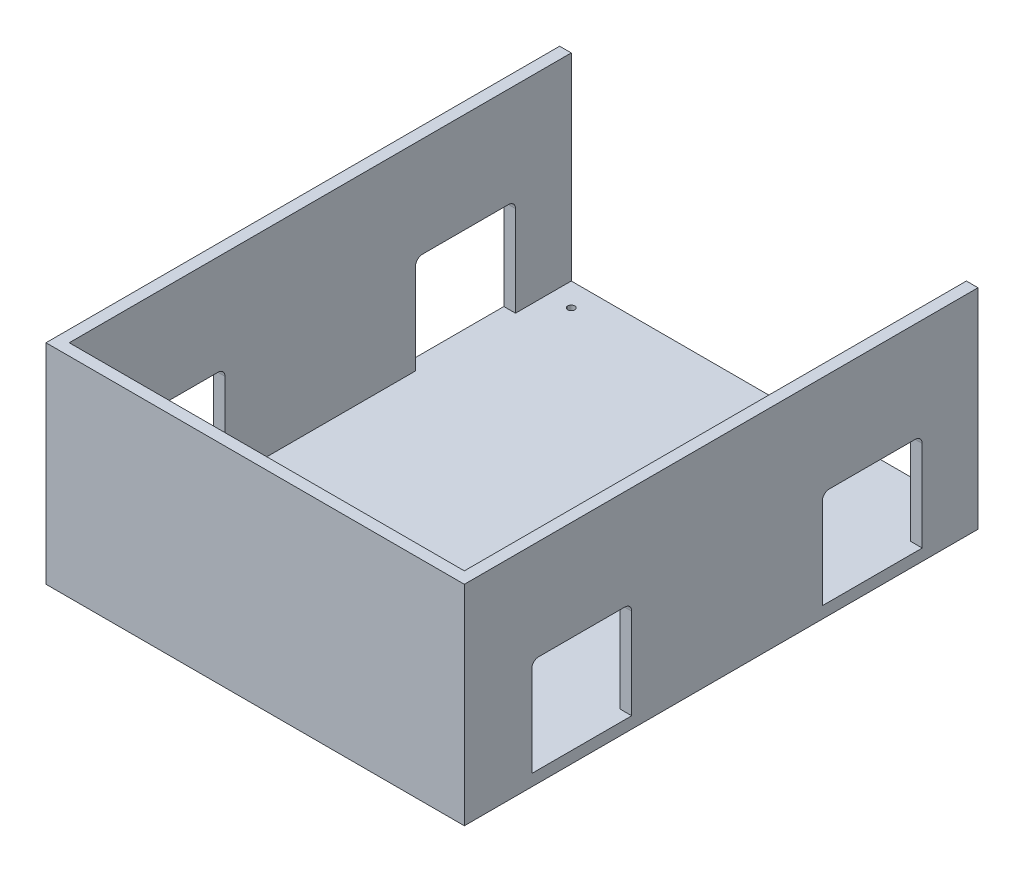
ISO-10303-21;
HEADER;
FILE_DESCRIPTION(('STEP AP214'),'2;1');
FILE_NAME('part.step','',(''),(''),'','','');
FILE_SCHEMA(('AUTOMOTIVE_DESIGN { 1 0 10303 214 1 1 1 1 }'));
ENDSEC;
DATA;
#1=APPLICATION_CONTEXT('core data for automotive mechanical design processes');
#2=APPLICATION_PROTOCOL_DEFINITION('international standard','automotive_design',2000,#1);
#3=PRODUCT_CONTEXT('',#1,'mechanical');
#4=PRODUCT('Part','Part','',(#3));
#5=PRODUCT_RELATED_PRODUCT_CATEGORY('part','',(#4));
#6=PRODUCT_DEFINITION_FORMATION('','',#4);
#7=PRODUCT_DEFINITION_CONTEXT('part definition',#1,'design');
#8=PRODUCT_DEFINITION('design','',#6,#7);
#9=PRODUCT_DEFINITION_SHAPE('','',#8);
#10=(LENGTH_UNIT() NAMED_UNIT(*) SI_UNIT(.MILLI.,.METRE.));
#11=(NAMED_UNIT(*) PLANE_ANGLE_UNIT() SI_UNIT($,.RADIAN.));
#12=(NAMED_UNIT(*) SI_UNIT($,.STERADIAN.) SOLID_ANGLE_UNIT());
#13=UNCERTAINTY_MEASURE_WITH_UNIT(LENGTH_MEASURE(1.E-05),#10,'distance_accuracy_value','');
#14=(GEOMETRIC_REPRESENTATION_CONTEXT(3) GLOBAL_UNCERTAINTY_ASSIGNED_CONTEXT((#13)) GLOBAL_UNIT_ASSIGNED_CONTEXT((#10,
#11,#12)) REPRESENTATION_CONTEXT('',''));
#15=CARTESIAN_POINT('',(0.,0.,0.));
#16=DIRECTION('',(0.,0.,1.));
#17=DIRECTION('',(1.,0.,0.));
#18=AXIS2_PLACEMENT_3D('',#15,#16,#17);
#19=CARTESIAN_POINT('',(0.,0.,0.));
#20=DIRECTION('',(0.,1.,0.));
#21=DIRECTION('',(0.,0.,1.));
#22=AXIS2_PLACEMENT_3D('',#19,#20,#21);
#23=PLANE('',#22);
#24=CARTESIAN_POINT('',(-75.,0.,-98.));
#25=DIRECTION('',(0.,1.,0.));
#26=DIRECTION('',(0.,0.,1.));
#27=AXIS2_PLACEMENT_3D('',#24,#25,#26);
#28=CIRCLE('',#27,1.5);
#29=CARTESIAN_POINT('',(-75.,0.,-96.5));
#30=VERTEX_POINT('',#29);
#31=EDGE_CURVE('E494',#30,#30,#28,.T.);
#32=ORIENTED_EDGE('',*,*,#31,.T.);
#33=EDGE_LOOP('',(#32));
#34=FACE_BOUND('',#33,.T.);
#35=CARTESIAN_POINT('',(75.,0.,98.));
#36=DIRECTION('',(0.,1.,0.));
#37=DIRECTION('',(0.,0.,1.));
#38=AXIS2_PLACEMENT_3D('',#35,#36,#37);
#39=CIRCLE('',#38,1.5);
#40=CARTESIAN_POINT('',(75.,0.,99.5));
#41=VERTEX_POINT('',#40);
#42=EDGE_CURVE('E473',#41,#41,#39,.T.);
#43=ORIENTED_EDGE('',*,*,#42,.T.);
#44=EDGE_LOOP('',(#43));
#45=FACE_BOUND('',#44,.T.);
#46=CARTESIAN_POINT('',(-75.,0.,98.));
#47=DIRECTION('',(0.,1.,0.));
#48=DIRECTION('',(0.,0.,1.));
#49=AXIS2_PLACEMENT_3D('',#46,#47,#48);
#50=CIRCLE('',#49,1.5);
#51=CARTESIAN_POINT('',(-75.,0.,99.5));
#52=VERTEX_POINT('',#51);
#53=EDGE_CURVE('E478',#52,#52,#50,.T.);
#54=ORIENTED_EDGE('',*,*,#53,.T.);
#55=EDGE_LOOP('',(#54));
#56=FACE_BOUND('',#55,.T.);
#57=CARTESIAN_POINT('',(75.,0.,-98.));
#58=DIRECTION('',(0.,1.,0.));
#59=DIRECTION('',(0.,0.,1.));
#60=AXIS2_PLACEMENT_3D('',#57,#58,#59);
#61=CIRCLE('',#60,1.5);
#62=CARTESIAN_POINT('',(75.,0.,-96.5));
#63=VERTEX_POINT('',#62);
#64=EDGE_CURVE('E488',#63,#63,#61,.T.);
#65=ORIENTED_EDGE('',*,*,#64,.T.);
#66=EDGE_LOOP('',(#65));
#67=FACE_BOUND('',#66,.T.);
#68=DIRECTION('',(-1.,0.,0.));
#69=VECTOR('',#68,1.);
#70=CARTESIAN_POINT('',(90.,0.,-108.));
#71=LINE('',#70,#69);
#72=CARTESIAN_POINT('',(90.,0.,-108.));
#73=VERTEX_POINT('',#72);
#74=CARTESIAN_POINT('',(-90.,0.,-108.));
#75=VERTEX_POINT('',#74);
#76=EDGE_CURVE('E283',#73,#75,#71,.T.);
#77=ORIENTED_EDGE('',*,*,#76,.F.);
#78=DIRECTION('',(0.,0.,-1.));
#79=VECTOR('',#78,1.);
#80=CARTESIAN_POINT('',(90.,0.,108.));
#81=LINE('',#80,#79);
#82=CARTESIAN_POINT('',(90.,0.,113.));
#83=VERTEX_POINT('',#82);
#84=EDGE_CURVE('E264',#83,#73,#81,.T.);
#85=ORIENTED_EDGE('',*,*,#84,.F.);
#86=DIRECTION('',(1.,0.,0.));
#87=VECTOR('',#86,1.);
#88=CARTESIAN_POINT('',(-90.,0.,113.));
#89=LINE('',#88,#87);
#90=CARTESIAN_POINT('',(-90.,0.,113.));
#91=VERTEX_POINT('',#90);
#92=EDGE_CURVE('E262',#91,#83,#89,.T.);
#93=ORIENTED_EDGE('',*,*,#92,.F.);
#94=DIRECTION('',(0.,0.,1.));
#95=VECTOR('',#94,1.);
#96=CARTESIAN_POINT('',(-90.,0.,108.));
#97=LINE('',#96,#95);
#98=EDGE_CURVE('E249',#75,#91,#97,.T.);
#99=ORIENTED_EDGE('',*,*,#98,.F.);
#100=EDGE_LOOP('',(#77,#85,#93,#99));
#101=FACE_BOUND('',#100,.T.);
#102=ADVANCED_FACE('F39',(#34,#45,#56,#67,#101),#23,.F.);
#103=CARTESIAN_POINT('',(85.,90.,-111.));
#104=DIRECTION('',(0.,-1.,0.));
#105=DIRECTION('',(0.,0.,-1.));
#106=AXIS2_PLACEMENT_3D('',#103,#104,#105);
#107=PLANE('',#106);
#108=DIRECTION('',(1.,0.,0.));
#109=VECTOR('',#108,1.);
#110=CARTESIAN_POINT('',(90.,90.,-108.));
#111=LINE('',#110,#109);
#112=CARTESIAN_POINT('',(85.,90.,-108.));
#113=VERTEX_POINT('',#112);
#114=CARTESIAN_POINT('',(90.,90.,-108.));
#115=VERTEX_POINT('',#114);
#116=EDGE_CURVE('E290',#113,#115,#111,.T.);
#117=ORIENTED_EDGE('',*,*,#116,.F.);
#118=DIRECTION('',(0.,0.,1.));
#119=VECTOR('',#118,1.);
#120=CARTESIAN_POINT('',(85.,90.,108.));
#121=LINE('',#120,#119);
#122=CARTESIAN_POINT('',(85.,90.,108.));
#123=VERTEX_POINT('',#122);
#124=EDGE_CURVE('E464',#113,#123,#121,.T.);
#125=ORIENTED_EDGE('',*,*,#124,.T.);
#126=DIRECTION('',(-1.,0.,0.));
#127=VECTOR('',#126,1.);
#128=CARTESIAN_POINT('',(-90.,90.,108.));
#129=LINE('',#128,#127);
#130=CARTESIAN_POINT('',(-85.,90.,108.));
#131=VERTEX_POINT('',#130);
#132=EDGE_CURVE('E273',#123,#131,#129,.T.);
#133=ORIENTED_EDGE('',*,*,#132,.T.);
#134=DIRECTION('',(0.,0.,-1.));
#135=VECTOR('',#134,1.);
#136=CARTESIAN_POINT('',(-85.,90.,-111.));
#137=LINE('',#136,#135);
#138=CARTESIAN_POINT('',(-84.9999999999999,90.,-108.));
#139=VERTEX_POINT('',#138);
#140=EDGE_CURVE('E375',#131,#139,#137,.T.);
#141=ORIENTED_EDGE('',*,*,#140,.T.);
#142=CARTESIAN_POINT('',(-90.,90.,-108.));
#143=VERTEX_POINT('',#142);
#144=EDGE_CURVE('E286',#143,#139,#111,.T.);
#145=ORIENTED_EDGE('',*,*,#144,.F.);
#146=DIRECTION('',(0.,0.,-1.));
#147=VECTOR('',#146,1.);
#148=CARTESIAN_POINT('',(-90.,90.,-111.));
#149=LINE('',#148,#147);
#150=CARTESIAN_POINT('',(-90.,90.,113.));
#151=VERTEX_POINT('',#150);
#152=EDGE_CURVE('E258',#151,#143,#149,.T.);
#153=ORIENTED_EDGE('',*,*,#152,.F.);
#154=DIRECTION('',(-1.,0.,0.));
#155=VECTOR('',#154,1.);
#156=CARTESIAN_POINT('',(-90.,90.,113.));
#157=LINE('',#156,#155);
#158=CARTESIAN_POINT('',(90.,90.,113.));
#159=VERTEX_POINT('',#158);
#160=EDGE_CURVE('E274',#159,#151,#157,.T.);
#161=ORIENTED_EDGE('',*,*,#160,.F.);
#162=DIRECTION('',(0.,0.,1.));
#163=VECTOR('',#162,1.);
#164=CARTESIAN_POINT('',(90.,90.,108.));
#165=LINE('',#164,#163);
#166=EDGE_CURVE('E461',#115,#159,#165,.T.);
#167=ORIENTED_EDGE('',*,*,#166,.F.);
#168=EDGE_LOOP('',(#117,#125,#133,#141,#145,#153,#161,#167));
#169=FACE_BOUND('',#168,.T.);
#170=ADVANCED_FACE('F576',(#169),#107,.F.);
#171=CARTESIAN_POINT('',(90.,0.,0.));
#172=DIRECTION('',(-1.,0.,0.));
#173=DIRECTION('',(0.,0.,1.));
#174=AXIS2_PLACEMENT_3D('',#171,#172,#173);
#175=PLANE('',#174);
#176=DIRECTION('',(0.,1.,0.));
#177=VECTOR('',#176,1.);
#178=CARTESIAN_POINT('',(90.,5.,-84.));
#179=LINE('',#178,#177);
#180=CARTESIAN_POINT('',(90.,5.,-84.));
#181=VERTEX_POINT('',#180);
#182=CARTESIAN_POINT('',(90.,44.,-84.));
#183=VERTEX_POINT('',#182);
#184=EDGE_CURVE('E377',#181,#183,#179,.T.);
#185=ORIENTED_EDGE('',*,*,#184,.F.);
#186=DIRECTION('',(0.,0.,-1.));
#187=VECTOR('',#186,1.);
#188=CARTESIAN_POINT('',(90.,5.,-84.));
#189=LINE('',#188,#187);
#190=CARTESIAN_POINT('',(90.,4.99999999999999,-41.));
#191=VERTEX_POINT('',#190);
#192=EDGE_CURVE('E388',#191,#181,#189,.T.);
#193=ORIENTED_EDGE('',*,*,#192,.F.);
#194=DIRECTION('',(0.,-1.,0.));
#195=VECTOR('',#194,1.);
#196=CARTESIAN_POINT('',(90.,4.99999999999999,-41.));
#197=LINE('',#196,#195);
#198=CARTESIAN_POINT('',(90.,44.,-41.));
#199=VERTEX_POINT('',#198);
#200=EDGE_CURVE('E389',#199,#191,#197,.T.);
#201=ORIENTED_EDGE('',*,*,#200,.F.);
#202=CARTESIAN_POINT('',(90.,44.,-44.));
#203=DIRECTION('',(1.,0.,0.));
#204=DIRECTION('',(0.,0.,-1.));
#205=AXIS2_PLACEMENT_3D('',#202,#203,#204);
#206=CIRCLE('',#205,3.00000000000001);
#207=CARTESIAN_POINT('',(90.,47.,-44.));
#208=VERTEX_POINT('',#207);
#209=EDGE_CURVE('E383',#208,#199,#206,.T.);
#210=ORIENTED_EDGE('',*,*,#209,.F.);
#211=DIRECTION('',(0.,0.,1.));
#212=VECTOR('',#211,1.);
#213=CARTESIAN_POINT('',(90.,47.,-81.));
#214=LINE('',#213,#212);
#215=CARTESIAN_POINT('',(90.,47.,-81.));
#216=VERTEX_POINT('',#215);
#217=EDGE_CURVE('E384',#216,#208,#214,.T.);
#218=ORIENTED_EDGE('',*,*,#217,.F.);
#219=CARTESIAN_POINT('',(90.,44.,-81.));
#220=DIRECTION('',(1.,0.,0.));
#221=DIRECTION('',(0.,0.,-1.));
#222=AXIS2_PLACEMENT_3D('',#219,#220,#221);
#223=CIRCLE('',#222,3.);
#224=EDGE_CURVE('E379',#183,#216,#223,.T.);
#225=ORIENTED_EDGE('',*,*,#224,.F.);
#226=EDGE_LOOP('',(#185,#193,#201,#210,#218,#225));
#227=FACE_BOUND('',#226,.T.);
#228=DIRECTION('',(0.,-1.,0.));
#229=VECTOR('',#228,1.);
#230=CARTESIAN_POINT('',(90.,5.,84.));
#231=LINE('',#230,#229);
#232=CARTESIAN_POINT('',(90.,44.,84.));
#233=VERTEX_POINT('',#232);
#234=CARTESIAN_POINT('',(90.,5.,84.));
#235=VERTEX_POINT('',#234);
#236=EDGE_CURVE('E417',#233,#235,#231,.T.);
#237=ORIENTED_EDGE('',*,*,#236,.F.);
#238=CARTESIAN_POINT('',(90.,44.,81.));
#239=DIRECTION('',(1.,0.,0.));
#240=DIRECTION('',(0.,0.,1.));
#241=AXIS2_PLACEMENT_3D('',#238,#239,#240);
#242=CIRCLE('',#241,3.);
#243=CARTESIAN_POINT('',(90.,47.,81.));
#244=VERTEX_POINT('',#243);
#245=EDGE_CURVE('E435',#244,#233,#242,.T.);
#246=ORIENTED_EDGE('',*,*,#245,.F.);
#247=DIRECTION('',(0.,0.,1.));
#248=VECTOR('',#247,1.);
#249=CARTESIAN_POINT('',(90.,47.,81.));
#250=LINE('',#249,#248);
#251=CARTESIAN_POINT('',(90.,47.,44.));
#252=VERTEX_POINT('',#251);
#253=EDGE_CURVE('E429',#252,#244,#250,.T.);
#254=ORIENTED_EDGE('',*,*,#253,.F.);
#255=CARTESIAN_POINT('',(90.,44.,44.));
#256=DIRECTION('',(1.,0.,0.));
#257=DIRECTION('',(0.,0.,1.));
#258=AXIS2_PLACEMENT_3D('',#255,#256,#257);
#259=CIRCLE('',#258,3.);
#260=CARTESIAN_POINT('',(90.,44.,41.));
#261=VERTEX_POINT('',#260);
#262=EDGE_CURVE('E430',#261,#252,#259,.T.);
#263=ORIENTED_EDGE('',*,*,#262,.F.);
#264=DIRECTION('',(0.,1.,0.));
#265=VECTOR('',#264,1.);
#266=CARTESIAN_POINT('',(90.,5.,41.));
#267=LINE('',#266,#265);
#268=CARTESIAN_POINT('',(90.,5.,41.));
#269=VERTEX_POINT('',#268);
#270=EDGE_CURVE('E424',#269,#261,#267,.T.);
#271=ORIENTED_EDGE('',*,*,#270,.F.);
#272=DIRECTION('',(0.,0.,-1.));
#273=VECTOR('',#272,1.);
#274=CARTESIAN_POINT('',(90.,5.,84.));
#275=LINE('',#274,#273);
#276=EDGE_CURVE('E422',#235,#269,#275,.T.);
#277=ORIENTED_EDGE('',*,*,#276,.F.);
#278=EDGE_LOOP('',(#237,#246,#254,#263,#271,#277));
#279=FACE_BOUND('',#278,.T.);
#280=DIRECTION('',(0.,-1.,0.));
#281=VECTOR('',#280,1.);
#282=CARTESIAN_POINT('',(90.,0.,-108.));
#283=LINE('',#282,#281);
#284=EDGE_CURVE('E281',#115,#73,#283,.T.);
#285=ORIENTED_EDGE('',*,*,#284,.F.);
#286=ORIENTED_EDGE('',*,*,#166,.T.);
#287=DIRECTION('',(0.,1.,0.));
#288=VECTOR('',#287,1.);
#289=CARTESIAN_POINT('',(90.,0.,113.));
#290=LINE('',#289,#288);
#291=EDGE_CURVE('E269',#83,#159,#290,.T.);
#292=ORIENTED_EDGE('',*,*,#291,.F.);
#293=ORIENTED_EDGE('',*,*,#84,.T.);
#294=EDGE_LOOP('',(#285,#286,#292,#293));
#295=FACE_BOUND('',#294,.T.);
#296=ADVANCED_FACE('F528',(#227,#279,#295),#175,.F.);
#297=CARTESIAN_POINT('',(-90.,0.,0.));
#298=DIRECTION('',(1.,0.,0.));
#299=DIRECTION('',(0.,0.,-1.));
#300=AXIS2_PLACEMENT_3D('',#297,#298,#299);
#301=PLANE('',#300);
#302=DIRECTION('',(0.,0.,1.));
#303=VECTOR('',#302,1.);
#304=CARTESIAN_POINT('',(-90.,5.,84.));
#305=LINE('',#304,#303);
#306=CARTESIAN_POINT('',(-90.,5.,41.));
#307=VERTEX_POINT('',#306);
#308=CARTESIAN_POINT('',(-90.,5.,84.));
#309=VERTEX_POINT('',#308);
#310=EDGE_CURVE('E293',#307,#309,#305,.T.);
#311=ORIENTED_EDGE('',*,*,#310,.F.);
#312=DIRECTION('',(0.,-1.,0.));
#313=VECTOR('',#312,1.);
#314=CARTESIAN_POINT('',(-90.,5.,41.));
#315=LINE('',#314,#313);
#316=CARTESIAN_POINT('',(-90.,44.,41.));
#317=VERTEX_POINT('',#316);
#318=EDGE_CURVE('E303',#317,#307,#315,.T.);
#319=ORIENTED_EDGE('',*,*,#318,.F.);
#320=CARTESIAN_POINT('',(-90.,44.,44.));
#321=DIRECTION('',(-1.,0.,0.));
#322=DIRECTION('',(0.,0.,-1.));
#323=AXIS2_PLACEMENT_3D('',#320,#321,#322);
#324=CIRCLE('',#323,3.);
#325=CARTESIAN_POINT('',(-90.,47.,44.));
#326=VERTEX_POINT('',#325);
#327=EDGE_CURVE('E297',#326,#317,#324,.T.);
#328=ORIENTED_EDGE('',*,*,#327,.F.);
#329=DIRECTION('',(0.,0.,-1.));
#330=VECTOR('',#329,1.);
#331=CARTESIAN_POINT('',(-90.,47.,44.));
#332=LINE('',#331,#330);
#333=CARTESIAN_POINT('',(-90.,47.,81.));
#334=VERTEX_POINT('',#333);
#335=EDGE_CURVE('E296',#334,#326,#332,.T.);
#336=ORIENTED_EDGE('',*,*,#335,.F.);
#337=CARTESIAN_POINT('',(-90.,44.,81.));
#338=DIRECTION('',(-1.,0.,0.));
#339=DIRECTION('',(0.,0.,-1.));
#340=AXIS2_PLACEMENT_3D('',#337,#338,#339);
#341=CIRCLE('',#340,3.);
#342=CARTESIAN_POINT('',(-90.,44.,84.));
#343=VERTEX_POINT('',#342);
#344=EDGE_CURVE('E298',#343,#334,#341,.T.);
#345=ORIENTED_EDGE('',*,*,#344,.F.);
#346=DIRECTION('',(0.,1.,0.));
#347=VECTOR('',#346,1.);
#348=CARTESIAN_POINT('',(-90.,44.,84.));
#349=LINE('',#348,#347);
#350=EDGE_CURVE('E291',#309,#343,#349,.T.);
#351=ORIENTED_EDGE('',*,*,#350,.F.);
#352=EDGE_LOOP('',(#311,#319,#328,#336,#345,#351));
#353=FACE_BOUND('',#352,.T.);
#354=DIRECTION('',(0.,0.,1.));
#355=VECTOR('',#354,1.);
#356=CARTESIAN_POINT('',(-90.,4.99999999999999,-41.));
#357=LINE('',#356,#355);
#358=CARTESIAN_POINT('',(-90.,5.,-84.));
#359=VERTEX_POINT('',#358);
#360=CARTESIAN_POINT('',(-90.,4.99999999999999,-41.));
#361=VERTEX_POINT('',#360);
#362=EDGE_CURVE('E333',#359,#361,#357,.T.);
#363=ORIENTED_EDGE('',*,*,#362,.F.);
#364=DIRECTION('',(0.,-1.,0.));
#365=VECTOR('',#364,1.);
#366=CARTESIAN_POINT('',(-90.,5.,-84.));
#367=LINE('',#366,#365);
#368=CARTESIAN_POINT('',(-90.,44.,-84.));
#369=VERTEX_POINT('',#368);
#370=EDGE_CURVE('E345',#369,#359,#367,.T.);
#371=ORIENTED_EDGE('',*,*,#370,.F.);
#372=CARTESIAN_POINT('',(-90.,44.,-81.));
#373=DIRECTION('',(-1.,0.,0.));
#374=DIRECTION('',(0.,0.,-1.));
#375=AXIS2_PLACEMENT_3D('',#372,#373,#374);
#376=CIRCLE('',#375,3.);
#377=CARTESIAN_POINT('',(-90.,47.,-81.));
#378=VERTEX_POINT('',#377);
#379=EDGE_CURVE('E338',#378,#369,#376,.T.);
#380=ORIENTED_EDGE('',*,*,#379,.F.);
#381=DIRECTION('',(0.,0.,-1.));
#382=VECTOR('',#381,1.);
#383=CARTESIAN_POINT('',(-90.,47.,-81.));
#384=LINE('',#383,#382);
#385=CARTESIAN_POINT('',(-90.,47.,-44.));
#386=VERTEX_POINT('',#385);
#387=EDGE_CURVE('E336',#386,#378,#384,.T.);
#388=ORIENTED_EDGE('',*,*,#387,.F.);
#389=CARTESIAN_POINT('',(-90.,44.,-44.));
#390=DIRECTION('',(-1.,0.,0.));
#391=DIRECTION('',(0.,0.,-1.));
#392=AXIS2_PLACEMENT_3D('',#389,#390,#391);
#393=CIRCLE('',#392,3.00000000000002);
#394=CARTESIAN_POINT('',(-90.,44.,-41.));
#395=VERTEX_POINT('',#394);
#396=EDGE_CURVE('E337',#395,#386,#393,.T.);
#397=ORIENTED_EDGE('',*,*,#396,.F.);
#398=DIRECTION('',(0.,1.,0.));
#399=VECTOR('',#398,1.);
#400=CARTESIAN_POINT('',(-90.,44.,-41.));
#401=LINE('',#400,#399);
#402=EDGE_CURVE('E331',#361,#395,#401,.T.);
#403=ORIENTED_EDGE('',*,*,#402,.F.);
#404=EDGE_LOOP('',(#363,#371,#380,#388,#397,#403));
#405=FACE_BOUND('',#404,.T.);
#406=DIRECTION('',(0.,1.,0.));
#407=VECTOR('',#406,1.);
#408=CARTESIAN_POINT('',(-90.,0.,-108.));
#409=LINE('',#408,#407);
#410=EDGE_CURVE('E257',#75,#143,#409,.T.);
#411=ORIENTED_EDGE('',*,*,#410,.F.);
#412=ORIENTED_EDGE('',*,*,#98,.T.);
#413=DIRECTION('',(0.,-1.,0.));
#414=VECTOR('',#413,1.);
#415=CARTESIAN_POINT('',(-90.,0.,113.));
#416=LINE('',#415,#414);
#417=EDGE_CURVE('E253',#151,#91,#416,.T.);
#418=ORIENTED_EDGE('',*,*,#417,.F.);
#419=ORIENTED_EDGE('',*,*,#152,.T.);
#420=EDGE_LOOP('',(#411,#412,#418,#419));
#421=FACE_BOUND('',#420,.T.);
#422=ADVANCED_FACE('F255',(#353,#405,#421),#301,.F.);
#423=CARTESIAN_POINT('',(0.,5.,0.));
#424=DIRECTION('',(0.,1.,0.));
#425=DIRECTION('',(0.,0.,1.));
#426=AXIS2_PLACEMENT_3D('',#423,#424,#425);
#427=PLANE('',#426);
#428=CARTESIAN_POINT('',(75.,5.,-98.));
#429=DIRECTION('',(0.,1.,0.));
#430=DIRECTION('',(0.,0.,1.));
#431=AXIS2_PLACEMENT_3D('',#428,#429,#430);
#432=CIRCLE('',#431,1.5);
#433=CARTESIAN_POINT('',(75.,5.,-96.5));
#434=VERTEX_POINT('',#433);
#435=EDGE_CURVE('E485',#434,#434,#432,.T.);
#436=ORIENTED_EDGE('',*,*,#435,.F.);
#437=EDGE_LOOP('',(#436));
#438=FACE_BOUND('',#437,.T.);
#439=CARTESIAN_POINT('',(-75.,5.,98.));
#440=DIRECTION('',(0.,1.,0.));
#441=DIRECTION('',(0.,0.,1.));
#442=AXIS2_PLACEMENT_3D('',#439,#440,#441);
#443=CIRCLE('',#442,1.5);
#444=CARTESIAN_POINT('',(-75.,5.,99.5));
#445=VERTEX_POINT('',#444);
#446=EDGE_CURVE('E490',#445,#445,#443,.T.);
#447=ORIENTED_EDGE('',*,*,#446,.F.);
#448=EDGE_LOOP('',(#447));
#449=FACE_BOUND('',#448,.T.);
#450=CARTESIAN_POINT('',(75.,5.,98.));
#451=DIRECTION('',(0.,1.,0.));
#452=DIRECTION('',(0.,0.,1.));
#453=AXIS2_PLACEMENT_3D('',#450,#451,#452);
#454=CIRCLE('',#453,1.5);
#455=CARTESIAN_POINT('',(75.,5.,99.5));
#456=VERTEX_POINT('',#455);
#457=EDGE_CURVE('E476',#456,#456,#454,.T.);
#458=ORIENTED_EDGE('',*,*,#457,.F.);
#459=EDGE_LOOP('',(#458));
#460=FACE_BOUND('',#459,.T.);
#461=CARTESIAN_POINT('',(-75.,5.,-98.));
#462=DIRECTION('',(0.,1.,0.));
#463=DIRECTION('',(0.,0.,1.));
#464=AXIS2_PLACEMENT_3D('',#461,#462,#463);
#465=CIRCLE('',#464,1.5);
#466=CARTESIAN_POINT('',(-75.,5.,-96.5));
#467=VERTEX_POINT('',#466);
#468=EDGE_CURVE('E482',#467,#467,#465,.T.);
#469=ORIENTED_EDGE('',*,*,#468,.F.);
#470=EDGE_LOOP('',(#469));
#471=FACE_BOUND('',#470,.T.);
#472=DIRECTION('',(0.,0.,-1.));
#473=VECTOR('',#472,1.);
#474=CARTESIAN_POINT('',(85.,5.,-108.));
#475=LINE('',#474,#473);
#476=CARTESIAN_POINT('',(85.,5.,108.));
#477=VERTEX_POINT('',#476);
#478=CARTESIAN_POINT('',(85.,5.,84.));
#479=VERTEX_POINT('',#478);
#480=EDGE_CURVE('E499',#477,#479,#475,.T.);
#481=ORIENTED_EDGE('',*,*,#480,.T.);
#482=DIRECTION('',(-1.,0.,0.));
#483=VECTOR('',#482,1.);
#484=CARTESIAN_POINT('',(90.,5.,84.));
#485=LINE('',#484,#483);
#486=EDGE_CURVE('E458',#235,#479,#485,.T.);
#487=ORIENTED_EDGE('',*,*,#486,.F.);
#488=ORIENTED_EDGE('',*,*,#276,.T.);
#489=DIRECTION('',(-1.,0.,0.));
#490=VECTOR('',#489,1.);
#491=CARTESIAN_POINT('',(90.,5.,41.));
#492=LINE('',#491,#490);
#493=CARTESIAN_POINT('',(85.,5.,41.));
#494=VERTEX_POINT('',#493);
#495=EDGE_CURVE('E456',#269,#494,#492,.T.);
#496=ORIENTED_EDGE('',*,*,#495,.T.);
#497=CARTESIAN_POINT('',(85.,4.99999999999999,-41.));
#498=VERTEX_POINT('',#497);
#499=EDGE_CURVE('E502',#494,#498,#475,.T.);
#500=ORIENTED_EDGE('',*,*,#499,.T.);
#501=DIRECTION('',(-1.,0.,0.));
#502=VECTOR('',#501,1.);
#503=CARTESIAN_POINT('',(90.,4.99999999999999,-41.));
#504=LINE('',#503,#502);
#505=EDGE_CURVE('E410',#191,#498,#504,.T.);
#506=ORIENTED_EDGE('',*,*,#505,.F.);
#507=ORIENTED_EDGE('',*,*,#192,.T.);
#508=DIRECTION('',(-1.,0.,0.));
#509=VECTOR('',#508,1.);
#510=CARTESIAN_POINT('',(90.,5.,-84.));
#511=LINE('',#510,#509);
#512=CARTESIAN_POINT('',(85.,5.,-84.));
#513=VERTEX_POINT('',#512);
#514=EDGE_CURVE('E395',#181,#513,#511,.T.);
#515=ORIENTED_EDGE('',*,*,#514,.T.);
#516=CARTESIAN_POINT('',(85.,5.,-108.));
#517=VERTEX_POINT('',#516);
#518=EDGE_CURVE('E500',#513,#517,#475,.T.);
#519=ORIENTED_EDGE('',*,*,#518,.T.);
#520=DIRECTION('',(-1.,0.,0.));
#521=VECTOR('',#520,1.);
#522=CARTESIAN_POINT('',(-85.,5.,-108.));
#523=LINE('',#522,#521);
#524=CARTESIAN_POINT('',(-85.,5.,-108.));
#525=VERTEX_POINT('',#524);
#526=EDGE_CURVE('E503',#517,#525,#523,.T.);
#527=ORIENTED_EDGE('',*,*,#526,.T.);
#528=DIRECTION('',(0.,0.,1.));
#529=VECTOR('',#528,1.);
#530=CARTESIAN_POINT('',(-85.,5.,-108.));
#531=LINE('',#530,#529);
#532=CARTESIAN_POINT('',(-85.,5.,-84.));
#533=VERTEX_POINT('',#532);
#534=EDGE_CURVE('E46',#525,#533,#531,.T.);
#535=ORIENTED_EDGE('',*,*,#534,.T.);
#536=DIRECTION('',(1.,0.,0.));
#537=VECTOR('',#536,1.);
#538=CARTESIAN_POINT('',(-90.,5.,-84.));
#539=LINE('',#538,#537);
#540=EDGE_CURVE('E343',#359,#533,#539,.T.);
#541=ORIENTED_EDGE('',*,*,#540,.F.);
#542=ORIENTED_EDGE('',*,*,#362,.T.);
#543=DIRECTION('',(1.,0.,0.));
#544=VECTOR('',#543,1.);
#545=CARTESIAN_POINT('',(-90.,4.99999999999999,-41.));
#546=LINE('',#545,#544);
#547=CARTESIAN_POINT('',(-85.,5.,-41.));
#548=VERTEX_POINT('',#547);
#549=EDGE_CURVE('E367',#361,#548,#546,.T.);
#550=ORIENTED_EDGE('',*,*,#549,.T.);
#551=CARTESIAN_POINT('',(-85.,5.,41.));
#552=VERTEX_POINT('',#551);
#553=EDGE_CURVE('E62',#548,#552,#531,.T.);
#554=ORIENTED_EDGE('',*,*,#553,.T.);
#555=DIRECTION('',(1.,0.,0.));
#556=VECTOR('',#555,1.);
#557=CARTESIAN_POINT('',(-90.,5.,41.));
#558=LINE('',#557,#556);
#559=EDGE_CURVE('E304',#307,#552,#558,.T.);
#560=ORIENTED_EDGE('',*,*,#559,.F.);
#561=ORIENTED_EDGE('',*,*,#310,.T.);
#562=DIRECTION('',(1.,0.,0.));
#563=VECTOR('',#562,1.);
#564=CARTESIAN_POINT('',(-90.,5.,84.));
#565=LINE('',#564,#563);
#566=CARTESIAN_POINT('',(-85.,5.,84.));
#567=VERTEX_POINT('',#566);
#568=EDGE_CURVE('E330',#309,#567,#565,.T.);
#569=ORIENTED_EDGE('',*,*,#568,.T.);
#570=CARTESIAN_POINT('',(-85.,5.,108.));
#571=VERTEX_POINT('',#570);
#572=EDGE_CURVE('E52',#567,#571,#531,.T.);
#573=ORIENTED_EDGE('',*,*,#572,.T.);
#574=DIRECTION('',(1.,0.,0.));
#575=VECTOR('',#574,1.);
#576=CARTESIAN_POINT('',(-85.,5.,108.));
#577=LINE('',#576,#575);
#578=EDGE_CURVE('E11',#571,#477,#577,.T.);
#579=ORIENTED_EDGE('',*,*,#578,.T.);
#580=EDGE_LOOP('',(#481,#487,#488,#496,#500,#506,#507,#515,#519,#527,#535,#541,#542,#550,#554,
#560,#561,#569,#573,#579));
#581=FACE_BOUND('',#580,.T.);
#582=ADVANCED_FACE('F507',(#438,#449,#460,#471,#581),#427,.T.);
#583=CARTESIAN_POINT('',(-75.,0.,-98.));
#584=DIRECTION('',(0.,1.,0.));
#585=DIRECTION('',(0.,0.,1.));
#586=AXIS2_PLACEMENT_3D('',#583,#584,#585);
#587=CYLINDRICAL_SURFACE('',#586,1.5);
#588=ORIENTED_EDGE('',*,*,#31,.F.);
#589=EDGE_LOOP('',(#588));
#590=FACE_BOUND('',#589,.T.);
#591=ORIENTED_EDGE('',*,*,#468,.T.);
#592=EDGE_LOOP('',(#591));
#593=FACE_BOUND('',#592,.T.);
#594=ADVANCED_FACE('F601',(#590,#593),#587,.F.);
#595=CARTESIAN_POINT('',(75.,0.,98.));
#596=DIRECTION('',(0.,1.,0.));
#597=DIRECTION('',(0.,0.,1.));
#598=AXIS2_PLACEMENT_3D('',#595,#596,#597);
#599=CYLINDRICAL_SURFACE('',#598,1.5);
#600=ORIENTED_EDGE('',*,*,#42,.F.);
#601=EDGE_LOOP('',(#600));
#602=FACE_BOUND('',#601,.T.);
#603=ORIENTED_EDGE('',*,*,#457,.T.);
#604=EDGE_LOOP('',(#603));
#605=FACE_BOUND('',#604,.T.);
#606=ADVANCED_FACE('F615',(#602,#605),#599,.F.);
#607=CARTESIAN_POINT('',(-75.,0.,98.));
#608=DIRECTION('',(0.,1.,0.));
#609=DIRECTION('',(0.,0.,1.));
#610=AXIS2_PLACEMENT_3D('',#607,#608,#609);
#611=CYLINDRICAL_SURFACE('',#610,1.5);
#612=ORIENTED_EDGE('',*,*,#53,.F.);
#613=EDGE_LOOP('',(#612));
#614=FACE_BOUND('',#613,.T.);
#615=ORIENTED_EDGE('',*,*,#446,.T.);
#616=EDGE_LOOP('',(#615));
#617=FACE_BOUND('',#616,.T.);
#618=ADVANCED_FACE('F596',(#614,#617),#611,.F.);
#619=CARTESIAN_POINT('',(75.,0.,-98.));
#620=DIRECTION('',(0.,1.,0.));
#621=DIRECTION('',(0.,0.,1.));
#622=AXIS2_PLACEMENT_3D('',#619,#620,#621);
#623=CYLINDRICAL_SURFACE('',#622,1.5);
#624=ORIENTED_EDGE('',*,*,#64,.F.);
#625=EDGE_LOOP('',(#624));
#626=FACE_BOUND('',#625,.T.);
#627=ORIENTED_EDGE('',*,*,#435,.T.);
#628=EDGE_LOOP('',(#627));
#629=FACE_BOUND('',#628,.T.);
#630=ADVANCED_FACE('F592',(#626,#629),#623,.F.);
#631=CARTESIAN_POINT('',(85.,0.,0.));
#632=DIRECTION('',(-1.,0.,0.));
#633=DIRECTION('',(0.,0.,1.));
#634=AXIS2_PLACEMENT_3D('',#631,#632,#633);
#635=PLANE('',#634);
#636=ORIENTED_EDGE('',*,*,#480,.F.);
#637=DIRECTION('',(0.,-1.,0.));
#638=VECTOR('',#637,1.);
#639=CARTESIAN_POINT('',(85.,0.,108.));
#640=LINE('',#639,#638);
#641=EDGE_CURVE('E463',#123,#477,#640,.T.);
#642=ORIENTED_EDGE('',*,*,#641,.F.);
#643=ORIENTED_EDGE('',*,*,#124,.F.);
#644=DIRECTION('',(0.,-1.,0.));
#645=VECTOR('',#644,1.);
#646=CARTESIAN_POINT('',(85.,0.,-108.));
#647=LINE('',#646,#645);
#648=EDGE_CURVE('E467',#113,#517,#647,.T.);
#649=ORIENTED_EDGE('',*,*,#648,.T.);
#650=ORIENTED_EDGE('',*,*,#518,.F.);
#651=DIRECTION('',(0.,1.,0.));
#652=VECTOR('',#651,1.);
#653=CARTESIAN_POINT('',(85.,5.,-84.));
#654=LINE('',#653,#652);
#655=CARTESIAN_POINT('',(85.,44.,-84.));
#656=VERTEX_POINT('',#655);
#657=EDGE_CURVE('E256',#513,#656,#654,.T.);
#658=ORIENTED_EDGE('',*,*,#657,.T.);
#659=CARTESIAN_POINT('',(85.,44.,-81.));
#660=DIRECTION('',(1.,0.,0.));
#661=DIRECTION('',(0.,0.,-1.));
#662=AXIS2_PLACEMENT_3D('',#659,#660,#661);
#663=CIRCLE('',#662,3.);
#664=CARTESIAN_POINT('',(85.,47.,-81.));
#665=VERTEX_POINT('',#664);
#666=EDGE_CURVE('E394',#656,#665,#663,.T.);
#667=ORIENTED_EDGE('',*,*,#666,.T.);
#668=DIRECTION('',(0.,0.,1.));
#669=VECTOR('',#668,1.);
#670=CARTESIAN_POINT('',(85.,47.,-81.));
#671=LINE('',#670,#669);
#672=CARTESIAN_POINT('',(85.,47.,-44.));
#673=VERTEX_POINT('',#672);
#674=EDGE_CURVE('E396',#665,#673,#671,.T.);
#675=ORIENTED_EDGE('',*,*,#674,.T.);
#676=CARTESIAN_POINT('',(85.,44.,-44.));
#677=DIRECTION('',(1.,0.,0.));
#678=DIRECTION('',(0.,0.,-1.));
#679=AXIS2_PLACEMENT_3D('',#676,#677,#678);
#680=CIRCLE('',#679,3.00000000000001);
#681=CARTESIAN_POINT('',(85.,44.,-41.));
#682=VERTEX_POINT('',#681);
#683=EDGE_CURVE('E402',#673,#682,#680,.T.);
#684=ORIENTED_EDGE('',*,*,#683,.T.);
#685=DIRECTION('',(0.,-1.,0.));
#686=VECTOR('',#685,1.);
#687=CARTESIAN_POINT('',(85.,4.99999999999999,-41.));
#688=LINE('',#687,#686);
#689=EDGE_CURVE('E382',#682,#498,#688,.T.);
#690=ORIENTED_EDGE('',*,*,#689,.T.);
#691=ORIENTED_EDGE('',*,*,#499,.F.);
#692=DIRECTION('',(0.,1.,0.));
#693=VECTOR('',#692,1.);
#694=CARTESIAN_POINT('',(85.,5.,41.));
#695=LINE('',#694,#693);
#696=CARTESIAN_POINT('',(85.,44.,41.));
#697=VERTEX_POINT('',#696);
#698=EDGE_CURVE('E440',#494,#697,#695,.T.);
#699=ORIENTED_EDGE('',*,*,#698,.T.);
#700=CARTESIAN_POINT('',(85.,44.,44.));
#701=DIRECTION('',(1.,0.,0.));
#702=DIRECTION('',(0.,0.,1.));
#703=AXIS2_PLACEMENT_3D('',#700,#701,#702);
#704=CIRCLE('',#703,3.);
#705=CARTESIAN_POINT('',(85.,47.,44.));
#706=VERTEX_POINT('',#705);
#707=EDGE_CURVE('E439',#697,#706,#704,.T.);
#708=ORIENTED_EDGE('',*,*,#707,.T.);
#709=DIRECTION('',(0.,0.,1.));
#710=VECTOR('',#709,1.);
#711=CARTESIAN_POINT('',(85.,47.,81.));
#712=LINE('',#711,#710);
#713=CARTESIAN_POINT('',(85.,47.,81.));
#714=VERTEX_POINT('',#713);
#715=EDGE_CURVE('E442',#706,#714,#712,.T.);
#716=ORIENTED_EDGE('',*,*,#715,.T.);
#717=CARTESIAN_POINT('',(85.,44.,81.));
#718=DIRECTION('',(1.,0.,0.));
#719=DIRECTION('',(0.,0.,1.));
#720=AXIS2_PLACEMENT_3D('',#717,#718,#719);
#721=CIRCLE('',#720,3.);
#722=CARTESIAN_POINT('',(85.,44.,84.));
#723=VERTEX_POINT('',#722);
#724=EDGE_CURVE('E421',#714,#723,#721,.T.);
#725=ORIENTED_EDGE('',*,*,#724,.T.);
#726=DIRECTION('',(0.,-1.,0.));
#727=VECTOR('',#726,1.);
#728=CARTESIAN_POINT('',(85.,5.,84.));
#729=LINE('',#728,#727);
#730=EDGE_CURVE('E419',#723,#479,#729,.T.);
#731=ORIENTED_EDGE('',*,*,#730,.T.);
#732=EDGE_LOOP('',(#636,#642,#643,#649,#650,#658,#667,#675,#684,#690,#691,#699,#708,#716,#725,#731));
#733=FACE_BOUND('',#732,.T.);
#734=ADVANCED_FACE('F520',(#733),#635,.T.);
#735=CARTESIAN_POINT('',(90.,5.,84.));
#736=DIRECTION('',(0.,0.,-1.));
#737=DIRECTION('',(-1.,0.,0.));
#738=AXIS2_PLACEMENT_3D('',#735,#736,#737);
#739=PLANE('',#738);
#740=ORIENTED_EDGE('',*,*,#730,.F.);
#741=DIRECTION('',(-1.,0.,0.));
#742=VECTOR('',#741,1.);
#743=CARTESIAN_POINT('',(90.,44.,84.));
#744=LINE('',#743,#742);
#745=EDGE_CURVE('E432',#233,#723,#744,.T.);
#746=ORIENTED_EDGE('',*,*,#745,.F.);
#747=ORIENTED_EDGE('',*,*,#236,.T.);
#748=ORIENTED_EDGE('',*,*,#486,.T.);
#749=EDGE_LOOP('',(#740,#746,#747,#748));
#750=FACE_BOUND('',#749,.T.);
#751=ADVANCED_FACE('F626',(#750),#739,.T.);
#752=CARTESIAN_POINT('',(90.,5.,41.));
#753=DIRECTION('',(0.,0.,1.));
#754=DIRECTION('',(1.,0.,0.));
#755=AXIS2_PLACEMENT_3D('',#752,#753,#754);
#756=PLANE('',#755);
#757=ORIENTED_EDGE('',*,*,#698,.F.);
#758=ORIENTED_EDGE('',*,*,#495,.F.);
#759=ORIENTED_EDGE('',*,*,#270,.T.);
#760=DIRECTION('',(-1.,0.,0.));
#761=VECTOR('',#760,1.);
#762=CARTESIAN_POINT('',(90.,44.,41.));
#763=LINE('',#762,#761);
#764=EDGE_CURVE('E451',#261,#697,#763,.T.);
#765=ORIENTED_EDGE('',*,*,#764,.T.);
#766=EDGE_LOOP('',(#757,#758,#759,#765));
#767=FACE_BOUND('',#766,.T.);
#768=ADVANCED_FACE('F534',(#767),#756,.T.);
#769=CARTESIAN_POINT('',(90.,44.,44.));
#770=DIRECTION('',(-1.,0.,0.));
#771=DIRECTION('',(0.,0.,1.));
#772=AXIS2_PLACEMENT_3D('',#769,#770,#771);
#773=CYLINDRICAL_SURFACE('',#772,3.);
#774=ORIENTED_EDGE('',*,*,#707,.F.);
#775=ORIENTED_EDGE('',*,*,#764,.F.);
#776=ORIENTED_EDGE('',*,*,#262,.T.);
#777=DIRECTION('',(-1.,0.,0.));
#778=VECTOR('',#777,1.);
#779=CARTESIAN_POINT('',(90.,47.,44.));
#780=LINE('',#779,#778);
#781=EDGE_CURVE('E454',#252,#706,#780,.T.);
#782=ORIENTED_EDGE('',*,*,#781,.T.);
#783=EDGE_LOOP('',(#774,#775,#776,#782));
#784=FACE_BOUND('',#783,.T.);
#785=ADVANCED_FACE('F539',(#784),#773,.F.);
#786=CARTESIAN_POINT('',(90.,47.,81.));
#787=DIRECTION('',(0.,-1.,0.));
#788=DIRECTION('',(0.,0.,-1.));
#789=AXIS2_PLACEMENT_3D('',#786,#787,#788);
#790=PLANE('',#789);
#791=ORIENTED_EDGE('',*,*,#715,.F.);
#792=ORIENTED_EDGE('',*,*,#781,.F.);
#793=ORIENTED_EDGE('',*,*,#253,.T.);
#794=DIRECTION('',(-1.,0.,0.));
#795=VECTOR('',#794,1.);
#796=CARTESIAN_POINT('',(90.,47.,81.));
#797=LINE('',#796,#795);
#798=EDGE_CURVE('E448',#244,#714,#797,.T.);
#799=ORIENTED_EDGE('',*,*,#798,.T.);
#800=EDGE_LOOP('',(#791,#792,#793,#799));
#801=FACE_BOUND('',#800,.T.);
#802=ADVANCED_FACE('F634',(#801),#790,.T.);
#803=CARTESIAN_POINT('',(90.,44.,81.));
#804=DIRECTION('',(-1.,0.,0.));
#805=DIRECTION('',(0.,0.,1.));
#806=AXIS2_PLACEMENT_3D('',#803,#804,#805);
#807=CYLINDRICAL_SURFACE('',#806,3.);
#808=ORIENTED_EDGE('',*,*,#724,.F.);
#809=ORIENTED_EDGE('',*,*,#798,.F.);
#810=ORIENTED_EDGE('',*,*,#245,.T.);
#811=ORIENTED_EDGE('',*,*,#745,.T.);
#812=EDGE_LOOP('',(#808,#809,#810,#811));
#813=FACE_BOUND('',#812,.T.);
#814=ADVANCED_FACE('F637',(#813),#807,.F.);
#815=CARTESIAN_POINT('',(90.,5.,-84.));
#816=DIRECTION('',(0.,0.,1.));
#817=DIRECTION('',(1.,0.,0.));
#818=AXIS2_PLACEMENT_3D('',#815,#816,#817);
#819=PLANE('',#818);
#820=ORIENTED_EDGE('',*,*,#657,.F.);
#821=ORIENTED_EDGE('',*,*,#514,.F.);
#822=ORIENTED_EDGE('',*,*,#184,.T.);
#823=DIRECTION('',(-1.,0.,0.));
#824=VECTOR('',#823,1.);
#825=CARTESIAN_POINT('',(90.,44.,-84.));
#826=LINE('',#825,#824);
#827=EDGE_CURVE('E418',#183,#656,#826,.T.);
#828=ORIENTED_EDGE('',*,*,#827,.T.);
#829=EDGE_LOOP('',(#820,#821,#822,#828));
#830=FACE_BOUND('',#829,.T.);
#831=ADVANCED_FACE('F548',(#830),#819,.T.);
#832=CARTESIAN_POINT('',(90.,44.,-81.));
#833=DIRECTION('',(-1.,0.,0.));
#834=DIRECTION('',(0.,0.,1.));
#835=AXIS2_PLACEMENT_3D('',#832,#833,#834);
#836=CYLINDRICAL_SURFACE('',#835,3.);
#837=ORIENTED_EDGE('',*,*,#666,.F.);
#838=ORIENTED_EDGE('',*,*,#827,.F.);
#839=ORIENTED_EDGE('',*,*,#224,.T.);
#840=DIRECTION('',(-1.,0.,0.));
#841=VECTOR('',#840,1.);
#842=CARTESIAN_POINT('',(90.,47.,-81.));
#843=LINE('',#842,#841);
#844=EDGE_CURVE('E413',#216,#665,#843,.T.);
#845=ORIENTED_EDGE('',*,*,#844,.T.);
#846=EDGE_LOOP('',(#837,#838,#839,#845));
#847=FACE_BOUND('',#846,.T.);
#848=ADVANCED_FACE('F553',(#847),#836,.F.);
#849=CARTESIAN_POINT('',(90.,47.,-81.));
#850=DIRECTION('',(0.,-1.,0.));
#851=DIRECTION('',(0.,0.,-1.));
#852=AXIS2_PLACEMENT_3D('',#849,#850,#851);
#853=PLANE('',#852);
#854=ORIENTED_EDGE('',*,*,#674,.F.);
#855=ORIENTED_EDGE('',*,*,#844,.F.);
#856=ORIENTED_EDGE('',*,*,#217,.T.);
#857=DIRECTION('',(-1.,0.,0.));
#858=VECTOR('',#857,1.);
#859=CARTESIAN_POINT('',(90.,47.,-44.));
#860=LINE('',#859,#858);
#861=EDGE_CURVE('E415',#208,#673,#860,.T.);
#862=ORIENTED_EDGE('',*,*,#861,.T.);
#863=EDGE_LOOP('',(#854,#855,#856,#862));
#864=FACE_BOUND('',#863,.T.);
#865=ADVANCED_FACE('F561',(#864),#853,.T.);
#866=CARTESIAN_POINT('',(90.,44.,-44.));
#867=DIRECTION('',(-1.,0.,0.));
#868=DIRECTION('',(0.,0.,1.));
#869=AXIS2_PLACEMENT_3D('',#866,#867,#868);
#870=CYLINDRICAL_SURFACE('',#869,3.00000000000001);
#871=ORIENTED_EDGE('',*,*,#683,.F.);
#872=ORIENTED_EDGE('',*,*,#861,.F.);
#873=ORIENTED_EDGE('',*,*,#209,.T.);
#874=DIRECTION('',(-1.,0.,0.));
#875=VECTOR('',#874,1.);
#876=CARTESIAN_POINT('',(90.,44.,-41.));
#877=LINE('',#876,#875);
#878=EDGE_CURVE('E408',#199,#682,#877,.T.);
#879=ORIENTED_EDGE('',*,*,#878,.T.);
#880=EDGE_LOOP('',(#871,#872,#873,#879));
#881=FACE_BOUND('',#880,.T.);
#882=ADVANCED_FACE('F562',(#881),#870,.F.);
#883=CARTESIAN_POINT('',(90.,4.99999999999999,-41.));
#884=DIRECTION('',(0.,0.,-1.));
#885=DIRECTION('',(-1.,0.,0.));
#886=AXIS2_PLACEMENT_3D('',#883,#884,#885);
#887=PLANE('',#886);
#888=ORIENTED_EDGE('',*,*,#689,.F.);
#889=ORIENTED_EDGE('',*,*,#878,.F.);
#890=ORIENTED_EDGE('',*,*,#200,.T.);
#891=ORIENTED_EDGE('',*,*,#505,.T.);
#892=EDGE_LOOP('',(#888,#889,#890,#891));
#893=FACE_BOUND('',#892,.T.);
#894=ADVANCED_FACE('F570',(#893),#887,.T.);
#895=CARTESIAN_POINT('',(-85.,0.,0.));
#896=DIRECTION('',(1.,0.,0.));
#897=DIRECTION('',(0.,0.,-1.));
#898=AXIS2_PLACEMENT_3D('',#895,#896,#897);
#899=PLANE('',#898);
#900=ORIENTED_EDGE('',*,*,#553,.F.);
#901=DIRECTION('',(0.,1.,0.));
#902=VECTOR('',#901,1.);
#903=CARTESIAN_POINT('',(-85.,44.,-41.));
#904=LINE('',#903,#902);
#905=CARTESIAN_POINT('',(-85.,44.,-41.));
#906=VERTEX_POINT('',#905);
#907=EDGE_CURVE('E329',#548,#906,#904,.T.);
#908=ORIENTED_EDGE('',*,*,#907,.T.);
#909=CARTESIAN_POINT('',(-85.,44.,-44.));
#910=DIRECTION('',(-1.,0.,0.));
#911=DIRECTION('',(0.,0.,-1.));
#912=AXIS2_PLACEMENT_3D('',#909,#910,#911);
#913=CIRCLE('',#912,3.00000000000002);
#914=CARTESIAN_POINT('',(-85.,47.,-44.));
#915=VERTEX_POINT('',#914);
#916=EDGE_CURVE('E347',#906,#915,#913,.T.);
#917=ORIENTED_EDGE('',*,*,#916,.T.);
#918=DIRECTION('',(0.,0.,-1.));
#919=VECTOR('',#918,1.);
#920=CARTESIAN_POINT('',(-85.,47.,-81.));
#921=LINE('',#920,#919);
#922=CARTESIAN_POINT('',(-85.,47.,-81.));
#923=VERTEX_POINT('',#922);
#924=EDGE_CURVE('E353',#915,#923,#921,.T.);
#925=ORIENTED_EDGE('',*,*,#924,.T.);
#926=CARTESIAN_POINT('',(-85.,44.,-81.));
#927=DIRECTION('',(-1.,0.,0.));
#928=DIRECTION('',(0.,0.,-1.));
#929=AXIS2_PLACEMENT_3D('',#926,#927,#928);
#930=CIRCLE('',#929,3.);
#931=CARTESIAN_POINT('',(-85.,44.,-84.));
#932=VERTEX_POINT('',#931);
#933=EDGE_CURVE('E354',#923,#932,#930,.T.);
#934=ORIENTED_EDGE('',*,*,#933,.T.);
#935=DIRECTION('',(0.,-1.,0.));
#936=VECTOR('',#935,1.);
#937=CARTESIAN_POINT('',(-85.,5.,-84.));
#938=LINE('',#937,#936);
#939=EDGE_CURVE('E334',#932,#533,#938,.T.);
#940=ORIENTED_EDGE('',*,*,#939,.T.);
#941=ORIENTED_EDGE('',*,*,#534,.F.);
#942=DIRECTION('',(0.,1.,0.));
#943=VECTOR('',#942,1.);
#944=CARTESIAN_POINT('',(-85.,0.,-108.));
#945=LINE('',#944,#943);
#946=EDGE_CURVE('E474',#525,#139,#945,.T.);
#947=ORIENTED_EDGE('',*,*,#946,.T.);
#948=ORIENTED_EDGE('',*,*,#140,.F.);
#949=DIRECTION('',(0.,1.,0.));
#950=VECTOR('',#949,1.);
#951=CARTESIAN_POINT('',(-85.,90.,108.));
#952=LINE('',#951,#950);
#953=EDGE_CURVE('E371',#571,#131,#952,.T.);
#954=ORIENTED_EDGE('',*,*,#953,.F.);
#955=ORIENTED_EDGE('',*,*,#572,.F.);
#956=DIRECTION('',(0.,1.,0.));
#957=VECTOR('',#956,1.);
#958=CARTESIAN_POINT('',(-85.,44.,84.));
#959=LINE('',#958,#957);
#960=CARTESIAN_POINT('',(-85.,44.,84.));
#961=VERTEX_POINT('',#960);
#962=EDGE_CURVE('E287',#567,#961,#959,.T.);
#963=ORIENTED_EDGE('',*,*,#962,.T.);
#964=CARTESIAN_POINT('',(-85.,44.,81.));
#965=DIRECTION('',(-1.,0.,0.));
#966=DIRECTION('',(0.,0.,-1.));
#967=AXIS2_PLACEMENT_3D('',#964,#965,#966);
#968=CIRCLE('',#967,3.);
#969=CARTESIAN_POINT('',(-85.,47.,81.));
#970=VERTEX_POINT('',#969);
#971=EDGE_CURVE('E310',#961,#970,#968,.T.);
#972=ORIENTED_EDGE('',*,*,#971,.T.);
#973=DIRECTION('',(0.,0.,-1.));
#974=VECTOR('',#973,1.);
#975=CARTESIAN_POINT('',(-85.,47.,44.));
#976=LINE('',#975,#974);
#977=CARTESIAN_POINT('',(-85.,47.,44.));
#978=VERTEX_POINT('',#977);
#979=EDGE_CURVE('E309',#970,#978,#976,.T.);
#980=ORIENTED_EDGE('',*,*,#979,.T.);
#981=CARTESIAN_POINT('',(-85.,44.,44.));
#982=DIRECTION('',(-1.,0.,0.));
#983=DIRECTION('',(0.,0.,-1.));
#984=AXIS2_PLACEMENT_3D('',#981,#982,#983);
#985=CIRCLE('',#984,3.);
#986=CARTESIAN_POINT('',(-85.,44.,41.));
#987=VERTEX_POINT('',#986);
#988=EDGE_CURVE('E312',#978,#987,#985,.T.);
#989=ORIENTED_EDGE('',*,*,#988,.T.);
#990=DIRECTION('',(0.,-1.,0.));
#991=VECTOR('',#990,1.);
#992=CARTESIAN_POINT('',(-85.,5.,41.));
#993=LINE('',#992,#991);
#994=EDGE_CURVE('E295',#987,#552,#993,.T.);
#995=ORIENTED_EDGE('',*,*,#994,.T.);
#996=EDGE_LOOP('',(#900,#908,#917,#925,#934,#940,#941,#947,#948,#954,#955,#963,#972,#980,#989,#995));
#997=FACE_BOUND('',#996,.T.);
#998=ADVANCED_FACE('F512',(#997),#899,.T.);
#999=CARTESIAN_POINT('',(-90.,44.,-41.));
#1000=DIRECTION('',(0.,0.,-1.));
#1001=DIRECTION('',(-1.,0.,0.));
#1002=AXIS2_PLACEMENT_3D('',#999,#1000,#1001);
#1003=PLANE('',#1002);
#1004=ORIENTED_EDGE('',*,*,#907,.F.);
#1005=ORIENTED_EDGE('',*,*,#549,.F.);
#1006=ORIENTED_EDGE('',*,*,#402,.T.);
#1007=DIRECTION('',(1.,0.,0.));
#1008=VECTOR('',#1007,1.);
#1009=CARTESIAN_POINT('',(-90.,44.,-41.));
#1010=LINE('',#1009,#1008);
#1011=EDGE_CURVE('E370',#395,#906,#1010,.T.);
#1012=ORIENTED_EDGE('',*,*,#1011,.T.);
#1013=EDGE_LOOP('',(#1004,#1005,#1006,#1012));
#1014=FACE_BOUND('',#1013,.T.);
#1015=ADVANCED_FACE('F574',(#1014),#1003,.T.);
#1016=CARTESIAN_POINT('',(-90.,44.,-44.));
#1017=DIRECTION('',(1.,0.,0.));
#1018=DIRECTION('',(0.,0.,-1.));
#1019=AXIS2_PLACEMENT_3D('',#1016,#1017,#1018);
#1020=CYLINDRICAL_SURFACE('',#1019,3.00000000000002);
#1021=ORIENTED_EDGE('',*,*,#916,.F.);
#1022=ORIENTED_EDGE('',*,*,#1011,.F.);
#1023=ORIENTED_EDGE('',*,*,#396,.T.);
#1024=DIRECTION('',(1.,0.,0.));
#1025=VECTOR('',#1024,1.);
#1026=CARTESIAN_POINT('',(-90.,47.,-44.));
#1027=LINE('',#1026,#1025);
#1028=EDGE_CURVE('E362',#386,#915,#1027,.T.);
#1029=ORIENTED_EDGE('',*,*,#1028,.T.);
#1030=EDGE_LOOP('',(#1021,#1022,#1023,#1029));
#1031=FACE_BOUND('',#1030,.T.);
#1032=ADVANCED_FACE('F687',(#1031),#1020,.F.);
#1033=CARTESIAN_POINT('',(-90.,47.,-81.));
#1034=DIRECTION('',(0.,-1.,0.));
#1035=DIRECTION('',(0.,0.,-1.));
#1036=AXIS2_PLACEMENT_3D('',#1033,#1034,#1035);
#1037=PLANE('',#1036);
#1038=ORIENTED_EDGE('',*,*,#924,.F.);
#1039=ORIENTED_EDGE('',*,*,#1028,.F.);
#1040=ORIENTED_EDGE('',*,*,#387,.T.);
#1041=DIRECTION('',(1.,0.,0.));
#1042=VECTOR('',#1041,1.);
#1043=CARTESIAN_POINT('',(-90.,47.,-81.));
#1044=LINE('',#1043,#1042);
#1045=EDGE_CURVE('E361',#378,#923,#1044,.T.);
#1046=ORIENTED_EDGE('',*,*,#1045,.T.);
#1047=EDGE_LOOP('',(#1038,#1039,#1040,#1046));
#1048=FACE_BOUND('',#1047,.T.);
#1049=ADVANCED_FACE('F699',(#1048),#1037,.T.);
#1050=CARTESIAN_POINT('',(-90.,44.,-81.));
#1051=DIRECTION('',(1.,0.,0.));
#1052=DIRECTION('',(0.,0.,-1.));
#1053=AXIS2_PLACEMENT_3D('',#1050,#1051,#1052);
#1054=CYLINDRICAL_SURFACE('',#1053,3.);
#1055=ORIENTED_EDGE('',*,*,#933,.F.);
#1056=ORIENTED_EDGE('',*,*,#1045,.F.);
#1057=ORIENTED_EDGE('',*,*,#379,.T.);
#1058=DIRECTION('',(1.,0.,0.));
#1059=VECTOR('',#1058,1.);
#1060=CARTESIAN_POINT('',(-90.,44.,-84.));
#1061=LINE('',#1060,#1059);
#1062=EDGE_CURVE('E363',#369,#932,#1061,.T.);
#1063=ORIENTED_EDGE('',*,*,#1062,.T.);
#1064=EDGE_LOOP('',(#1055,#1056,#1057,#1063));
#1065=FACE_BOUND('',#1064,.T.);
#1066=ADVANCED_FACE('F708',(#1065),#1054,.F.);
#1067=CARTESIAN_POINT('',(-90.,5.,-84.));
#1068=DIRECTION('',(0.,0.,1.));
#1069=DIRECTION('',(1.,0.,0.));
#1070=AXIS2_PLACEMENT_3D('',#1067,#1068,#1069);
#1071=PLANE('',#1070);
#1072=ORIENTED_EDGE('',*,*,#939,.F.);
#1073=ORIENTED_EDGE('',*,*,#1062,.F.);
#1074=ORIENTED_EDGE('',*,*,#370,.T.);
#1075=ORIENTED_EDGE('',*,*,#540,.T.);
#1076=EDGE_LOOP('',(#1072,#1073,#1074,#1075));
#1077=FACE_BOUND('',#1076,.T.);
#1078=ADVANCED_FACE('F719',(#1077),#1071,.T.);
#1079=CARTESIAN_POINT('',(-90.,44.,84.));
#1080=DIRECTION('',(0.,0.,-1.));
#1081=DIRECTION('',(-1.,0.,0.));
#1082=AXIS2_PLACEMENT_3D('',#1079,#1080,#1081);
#1083=PLANE('',#1082);
#1084=ORIENTED_EDGE('',*,*,#962,.F.);
#1085=ORIENTED_EDGE('',*,*,#568,.F.);
#1086=ORIENTED_EDGE('',*,*,#350,.T.);
#1087=DIRECTION('',(1.,0.,0.));
#1088=VECTOR('',#1087,1.);
#1089=CARTESIAN_POINT('',(-90.,44.,84.));
#1090=LINE('',#1089,#1088);
#1091=EDGE_CURVE('E323',#343,#961,#1090,.T.);
#1092=ORIENTED_EDGE('',*,*,#1091,.T.);
#1093=EDGE_LOOP('',(#1084,#1085,#1086,#1092));
#1094=FACE_BOUND('',#1093,.T.);
#1095=ADVANCED_FACE('F728',(#1094),#1083,.T.);
#1096=CARTESIAN_POINT('',(-90.,44.,81.));
#1097=DIRECTION('',(1.,0.,0.));
#1098=DIRECTION('',(0.,0.,-1.));
#1099=AXIS2_PLACEMENT_3D('',#1096,#1097,#1098);
#1100=CYLINDRICAL_SURFACE('',#1099,3.);
#1101=ORIENTED_EDGE('',*,*,#971,.F.);
#1102=ORIENTED_EDGE('',*,*,#1091,.F.);
#1103=ORIENTED_EDGE('',*,*,#344,.T.);
#1104=DIRECTION('',(1.,0.,0.));
#1105=VECTOR('',#1104,1.);
#1106=CARTESIAN_POINT('',(-90.,47.,81.));
#1107=LINE('',#1106,#1105);
#1108=EDGE_CURVE('E325',#334,#970,#1107,.T.);
#1109=ORIENTED_EDGE('',*,*,#1108,.T.);
#1110=EDGE_LOOP('',(#1101,#1102,#1103,#1109));
#1111=FACE_BOUND('',#1110,.T.);
#1112=ADVANCED_FACE('F739',(#1111),#1100,.F.);
#1113=CARTESIAN_POINT('',(-90.,47.,44.));
#1114=DIRECTION('',(0.,-1.,0.));
#1115=DIRECTION('',(0.,0.,-1.));
#1116=AXIS2_PLACEMENT_3D('',#1113,#1114,#1115);
#1117=PLANE('',#1116);
#1118=ORIENTED_EDGE('',*,*,#979,.F.);
#1119=ORIENTED_EDGE('',*,*,#1108,.F.);
#1120=ORIENTED_EDGE('',*,*,#335,.T.);
#1121=DIRECTION('',(1.,0.,0.));
#1122=VECTOR('',#1121,1.);
#1123=CARTESIAN_POINT('',(-90.,47.,44.));
#1124=LINE('',#1123,#1122);
#1125=EDGE_CURVE('E322',#326,#978,#1124,.T.);
#1126=ORIENTED_EDGE('',*,*,#1125,.T.);
#1127=EDGE_LOOP('',(#1118,#1119,#1120,#1126));
#1128=FACE_BOUND('',#1127,.T.);
#1129=ADVANCED_FACE('F749',(#1128),#1117,.T.);
#1130=CARTESIAN_POINT('',(-90.,44.,44.));
#1131=DIRECTION('',(1.,0.,0.));
#1132=DIRECTION('',(0.,0.,-1.));
#1133=AXIS2_PLACEMENT_3D('',#1130,#1131,#1132);
#1134=CYLINDRICAL_SURFACE('',#1133,3.);
#1135=ORIENTED_EDGE('',*,*,#988,.F.);
#1136=ORIENTED_EDGE('',*,*,#1125,.F.);
#1137=ORIENTED_EDGE('',*,*,#327,.T.);
#1138=DIRECTION('',(1.,0.,0.));
#1139=VECTOR('',#1138,1.);
#1140=CARTESIAN_POINT('',(-90.,44.,41.));
#1141=LINE('',#1140,#1139);
#1142=EDGE_CURVE('E316',#317,#987,#1141,.T.);
#1143=ORIENTED_EDGE('',*,*,#1142,.T.);
#1144=EDGE_LOOP('',(#1135,#1136,#1137,#1143));
#1145=FACE_BOUND('',#1144,.T.);
#1146=ADVANCED_FACE('F759',(#1145),#1134,.F.);
#1147=CARTESIAN_POINT('',(-90.,5.,41.));
#1148=DIRECTION('',(0.,0.,1.));
#1149=DIRECTION('',(1.,0.,0.));
#1150=AXIS2_PLACEMENT_3D('',#1147,#1148,#1149);
#1151=PLANE('',#1150);
#1152=ORIENTED_EDGE('',*,*,#994,.F.);
#1153=ORIENTED_EDGE('',*,*,#1142,.F.);
#1154=ORIENTED_EDGE('',*,*,#318,.T.);
#1155=ORIENTED_EDGE('',*,*,#559,.T.);
#1156=EDGE_LOOP('',(#1152,#1153,#1154,#1155));
#1157=FACE_BOUND('',#1156,.T.);
#1158=ADVANCED_FACE('F769',(#1157),#1151,.T.);
#1159=CARTESIAN_POINT('',(0.,0.,-108.));
#1160=DIRECTION('',(0.,0.,1.));
#1161=DIRECTION('',(1.,0.,0.));
#1162=AXIS2_PLACEMENT_3D('',#1159,#1160,#1161);
#1163=PLANE('',#1162);
#1164=ORIENTED_EDGE('',*,*,#116,.T.);
#1165=ORIENTED_EDGE('',*,*,#284,.T.);
#1166=ORIENTED_EDGE('',*,*,#76,.T.);
#1167=ORIENTED_EDGE('',*,*,#410,.T.);
#1168=ORIENTED_EDGE('',*,*,#144,.T.);
#1169=ORIENTED_EDGE('',*,*,#946,.F.);
#1170=ORIENTED_EDGE('',*,*,#526,.F.);
#1171=ORIENTED_EDGE('',*,*,#648,.F.);
#1172=EDGE_LOOP('',(#1164,#1165,#1166,#1167,#1168,#1169,#1170,#1171));
#1173=FACE_BOUND('',#1172,.T.);
#1174=ADVANCED_FACE('F778',(#1173),#1163,.F.);
#1175=CARTESIAN_POINT('',(0.,0.,113.));
#1176=DIRECTION('',(0.,0.,-1.));
#1177=DIRECTION('',(-1.,0.,0.));
#1178=AXIS2_PLACEMENT_3D('',#1175,#1176,#1177);
#1179=PLANE('',#1178);
#1180=ORIENTED_EDGE('',*,*,#417,.T.);
#1181=ORIENTED_EDGE('',*,*,#92,.T.);
#1182=ORIENTED_EDGE('',*,*,#291,.T.);
#1183=ORIENTED_EDGE('',*,*,#160,.T.);
#1184=EDGE_LOOP('',(#1180,#1181,#1182,#1183));
#1185=FACE_BOUND('',#1184,.T.);
#1186=ADVANCED_FACE('F275',(#1185),#1179,.F.);
#1187=CARTESIAN_POINT('',(0.,0.,108.));
#1188=DIRECTION('',(0.,0.,-1.));
#1189=DIRECTION('',(-1.,0.,0.));
#1190=AXIS2_PLACEMENT_3D('',#1187,#1188,#1189);
#1191=PLANE('',#1190);
#1192=ORIENTED_EDGE('',*,*,#132,.F.);
#1193=ORIENTED_EDGE('',*,*,#641,.T.);
#1194=ORIENTED_EDGE('',*,*,#578,.F.);
#1195=ORIENTED_EDGE('',*,*,#953,.T.);
#1196=EDGE_LOOP('',(#1192,#1193,#1194,#1195));
#1197=FACE_BOUND('',#1196,.T.);
#1198=ADVANCED_FACE('F511',(#1197),#1191,.T.);
#1199=CLOSED_SHELL('',(#102,#170,#296,#422,#582,#594,#606,#618,#630,#734,#751,#768,#785,#802,
#814,#831,#848,#865,#882,#894,#998,#1015,#1032,#1049,#1066,#1078,#1095,#1112,#1129,#1146,#1158,
#1174,#1186,#1198));
#1200=MANIFOLD_SOLID_BREP('B2',#1199);
#1201=ADVANCED_BREP_SHAPE_REPRESENTATION('',(#18,#1200),#14);
#1202=SHAPE_DEFINITION_REPRESENTATION(#9,#1201);
ENDSEC;
END-ISO-10303-21;
